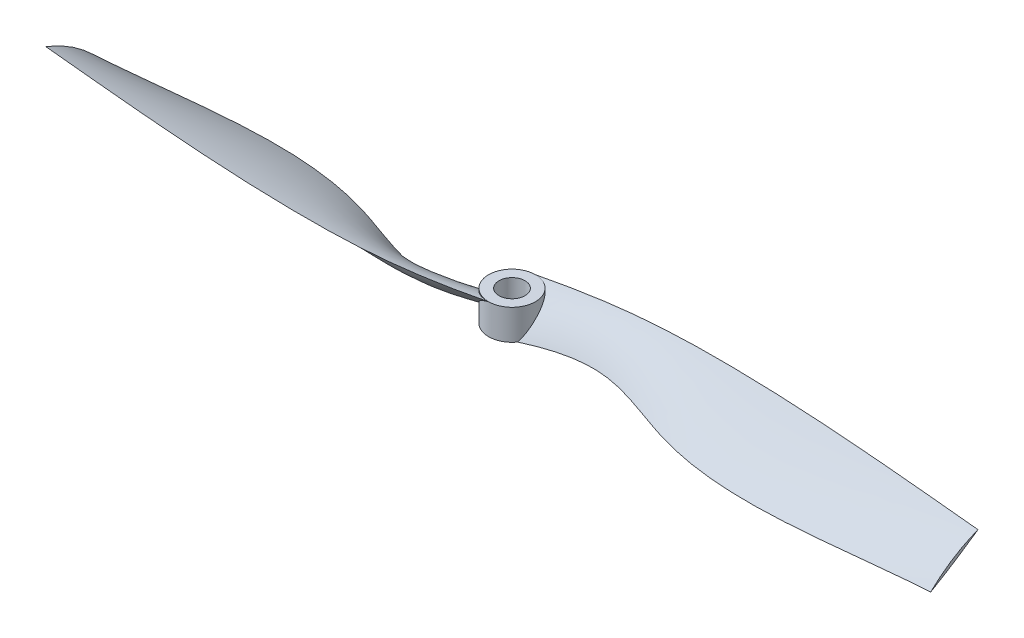
ISO-10303-21;
HEADER;
FILE_DESCRIPTION(('STEP AP214'),'2;1');
FILE_NAME('part.step','',(''),(''),'','','');
FILE_SCHEMA(('AUTOMOTIVE_DESIGN { 1 0 10303 214 1 1 1 1 }'));
ENDSEC;
DATA;
#1=APPLICATION_CONTEXT('core data for automotive mechanical design processes');
#2=APPLICATION_PROTOCOL_DEFINITION('international standard','automotive_design',2000,#1);
#3=PRODUCT_CONTEXT('',#1,'mechanical');
#4=PRODUCT('Part','Part','',(#3));
#5=PRODUCT_RELATED_PRODUCT_CATEGORY('part','',(#4));
#6=PRODUCT_DEFINITION_FORMATION('','',#4);
#7=PRODUCT_DEFINITION_CONTEXT('part definition',#1,'design');
#8=PRODUCT_DEFINITION('design','',#6,#7);
#9=PRODUCT_DEFINITION_SHAPE('','',#8);
#10=(LENGTH_UNIT() NAMED_UNIT(*) SI_UNIT(.MILLI.,.METRE.));
#11=(NAMED_UNIT(*) PLANE_ANGLE_UNIT() SI_UNIT($,.RADIAN.));
#12=(NAMED_UNIT(*) SI_UNIT($,.STERADIAN.) SOLID_ANGLE_UNIT());
#13=UNCERTAINTY_MEASURE_WITH_UNIT(LENGTH_MEASURE(1.E-05),#10,'distance_accuracy_value','');
#14=(GEOMETRIC_REPRESENTATION_CONTEXT(3) GLOBAL_UNCERTAINTY_ASSIGNED_CONTEXT((#13)) GLOBAL_UNIT_ASSIGNED_CONTEXT((#10,
#11,#12)) REPRESENTATION_CONTEXT('',''));
#15=CARTESIAN_POINT('',(0.,0.,0.));
#16=DIRECTION('',(0.,0.,1.));
#17=DIRECTION('',(1.,0.,0.));
#18=AXIS2_PLACEMENT_3D('',#15,#16,#17);
#19=CARTESIAN_POINT('',(0.,3.5,0.));
#20=DIRECTION('',(0.,-1.,0.));
#21=DIRECTION('',(0.,0.,-1.));
#22=AXIS2_PLACEMENT_3D('',#19,#20,#21);
#23=CYLINDRICAL_SURFACE('',#22,5.4);
#24=CARTESIAN_POINT('',(0.,-3.5,0.));
#25=DIRECTION('',(0.,1.,0.));
#26=DIRECTION('',(0.,0.,1.));
#27=AXIS2_PLACEMENT_3D('',#24,#25,#26);
#28=CIRCLE('',#27,5.4);
#29=CARTESIAN_POINT('',(-4.42153871093102,-3.5,-3.09999926253837));
#30=VERTEX_POINT('',#29);
#31=CARTESIAN_POINT('',(4.42153871093102,-3.5,3.09999926253837));
#32=VERTEX_POINT('',#31);
#33=EDGE_CURVE('E43',#30,#32,#28,.T.);
#34=ORIENTED_EDGE('',*,*,#33,.T.);
#35=CARTESIAN_POINT('',(4.42153871093102,-3.5,3.09999926253837));
#36=CARTESIAN_POINT('',(4.46274032845653,-3.4332596109734,3.04121880173989));
#37=CARTESIAN_POINT('',(4.50226301038118,-3.36556674417809,2.98236842523043));
#38=CARTESIAN_POINT('',(4.57818270502359,-3.2286509153384,2.86446880598099));
#39=CARTESIAN_POINT('',(4.61458049463764,-3.15942833901599,2.80541961648499));
#40=CARTESIAN_POINT('',(4.68446691957244,-3.01986618856876,2.68709503586211));
#41=CARTESIAN_POINT('',(4.71795851126925,-2.94952783775064,2.62781994019167));
#42=CARTESIAN_POINT('',(4.78225579516463,-2.80793451781135,2.50890354205042));
#43=CARTESIAN_POINT('',(4.81306129280275,-2.73667948272071,2.4492622133868));
#44=CARTESIAN_POINT('',(4.90167408364064,-2.52190506903903,2.26967785354244));
#45=CARTESIAN_POINT('',(4.95568311027789,-2.37736534987981,2.14906518548834));
#46=CARTESIAN_POINT('',(5.05495760627506,-2.08526469556819,1.90396761382263));
#47=CARTESIAN_POINT('',(5.10010434742793,-1.93768863929287,1.77945306975395));
#48=CARTESIAN_POINT('',(5.18115773456361,-1.64247993916782,1.52745636368072));
#49=CARTESIAN_POINT('',(5.2170626403101,-1.49484728989536,1.39997364769069));
#50=CARTESIAN_POINT('',(5.27962041636862,-1.20059788286626,1.14160948253018));
#51=CARTESIAN_POINT('',(5.30627372250697,-1.05398107757398,1.01072819377266));
#52=CARTESIAN_POINT('',(5.3457723297265,-0.791029028872365,0.771013145435731));
#53=CARTESIAN_POINT('',(5.3602942955066,-0.674345211913465,0.66283662869607));
#54=CARTESIAN_POINT('',(5.38284503794041,-0.442782060976604,0.443941245223382));
#55=CARTESIAN_POINT('',(5.39087517713352,-0.327902353308487,0.333222916998899));
#56=CARTESIAN_POINT('',(5.40006105914017,-0.100422661009188,0.109151522360341));
#57=CARTESIAN_POINT('',(5.4012159984033,0.0121770556115914,-0.00420185047472414));
#58=CARTESIAN_POINT('',(5.39617794077688,0.234100094520888,-0.233041361763288));
#59=CARTESIAN_POINT('',(5.39001456279705,0.343434800182564,-0.3485170536302));
#60=CARTESIAN_POINT('',(5.36983294678711,0.558735946117716,-0.581903050771586));
#61=CARTESIAN_POINT('',(5.3558151291518,0.664702566341191,-0.699813225419439));
#62=CARTESIAN_POINT('',(5.31931194890085,0.872649432949757,-0.937764824548423));
#63=CARTESIAN_POINT('',(5.2968293905647,0.974630987208451,-1.05780553067107));
#64=CARTESIAN_POINT('',(5.2408584967523,1.18096490191177,-1.30803634619239));
#65=CARTESIAN_POINT('',(5.20671402140603,1.28498968447556,-1.43835214950685));
#66=CARTESIAN_POINT('',(5.12718842819552,1.48704312036879,-1.70019212563268));
#67=CARTESIAN_POINT('',(5.08180907997348,1.58507271499064,-1.83171610500162));
#68=CARTESIAN_POINT('',(4.97908281037961,1.77438798226409,-2.09491787014866));
#69=CARTESIAN_POINT('',(4.92173911024035,1.86567546119602,-2.2265956050605));
#70=CARTESIAN_POINT('',(4.79447833265996,2.04086504826742,-2.48881727210416));
#71=CARTESIAN_POINT('',(4.72456107226371,2.12476704891596,-2.61936118770905));
#72=CARTESIAN_POINT('',(4.57110945600634,2.28534628464075,-2.87886680521823));
#73=CARTESIAN_POINT('',(4.48746077844135,2.36195351067683,-3.00780450386313));
#74=CARTESIAN_POINT('',(4.30691542930918,2.50673955005529,-3.2610827272484));
#75=CARTESIAN_POINT('',(4.21001857436033,2.57491824670483,-3.3854231883234));
#76=CARTESIAN_POINT('',(4.00329875584586,2.7027078550697,-3.62752329923112));
#77=CARTESIAN_POINT('',(3.89348011757408,2.76232161895906,-3.74528513176542));
#78=CARTESIAN_POINT('',(3.6615421806222,2.87315041501566,-3.9723335473523));
#79=CARTESIAN_POINT('',(3.53942443775241,2.92436650732167,-4.08162119928272));
#80=CARTESIAN_POINT('',(3.30045739417401,3.01267056545271,-4.27639711165135));
#81=CARTESIAN_POINT('',(3.18497932999765,3.05072939642684,-4.3631336585759));
#82=CARTESIAN_POINT('',(2.94625022630216,3.12117882259513,-4.52776191658591));
#83=CARTESIAN_POINT('',(2.82299944988176,3.15356960950711,-4.60565392680064));
#84=CARTESIAN_POINT('',(2.56959215698793,3.21315832591706,-4.75169376191945));
#85=CARTESIAN_POINT('',(2.43943277295592,3.24035407722736,-4.819837496548));
#86=CARTESIAN_POINT('',(2.17325504261599,3.29004621296248,-4.94556629009211));
#87=CARTESIAN_POINT('',(2.03723687184039,3.31254273806061,-5.00315166507026));
#88=CARTESIAN_POINT('',(1.76449131669241,3.35275230624365,-5.1056010643945));
#89=CARTESIAN_POINT('',(1.62790418335913,3.37058726317697,-5.15079127665522));
#90=CARTESIAN_POINT('',(1.35118082433203,3.40278024641318,-5.23020349827175));
#91=CARTESIAN_POINT('',(1.21104469725939,3.41713836921519,-5.26442581204885));
#92=CARTESIAN_POINT('',(0.9284924127026,3.44277351236691,-5.32152624765928));
#93=CARTESIAN_POINT('',(0.786081101218947,3.454056343641,-5.34442583201194));
#94=CARTESIAN_POINT('',(0.499758174433112,3.473939574675,-5.3787554764918));
#95=CARTESIAN_POINT('',(0.355847508354317,3.48254157627511,-5.39019239484068));
#96=CARTESIAN_POINT('',(0.176425143269606,3.49176997264785,-5.39723286523522));
#97=CARTESIAN_POINT('',(0.141135652113325,3.49351317887583,-5.39827087312406));
#98=CARTESIAN_POINT('',(0.0705660864384261,3.49685986879952,-5.39965403755672));
#99=CARTESIAN_POINT('',(0.0352860287658672,3.49846346823568,-5.39999977336036));
#100=CARTESIAN_POINT('',(0.,3.5,-5.4));
#101=B_SPLINE_CURVE_WITH_KNOTS('',3,(#35,#36,#37,#38,#39,#40,#41,#42,#43,#44,#45,#46,#47,#48,
#49,#50,#51,#52,#53,#54,#55,#56,#57,#58,#59,#60,#61,#62,#63,#64,#65,#66,#67,#68,#69,#70,#71,#72,
#73,#74,#75,#76,#77,#78,#79,#80,#81,#82,#83,#84,#85,#86,#87,#88,#89,#90,#91,#92,#93,#94,#95,#96,
#97,#98,#99,#100),.UNSPECIFIED.,.F.,.F.,(4,2,2,2,2,2,2,2,2,2,2,2,2,2,2,2,2,2,2,2,2,2,2,2,2,2,2,
2,2,2,2,2,4),(0.,0.294004526473737,0.587935745946308,0.881564365442731,1.17521423555069,
1.76246785042509,2.35711998397875,2.95188400866676,3.54662001128096,4.02579915507174,
4.50487770004362,4.98401223701774,5.4612141979532,5.93839061994788,6.41540909731794,
6.92557035605195,7.43565130865661,7.94559510598498,8.45554632399419,8.96998122878728,
9.48442325512461,9.99869357012648,10.5128989125512,10.9604064129298,11.4078987737376,
11.8555783504193,12.3032445237044,12.7376554544466,13.172054326781,13.6056265979084,
14.0389393035011,14.1449786125251,14.2509291558402),.UNSPECIFIED.);
#102=CARTESIAN_POINT('',(0.,3.5,-5.4));
#103=VERTEX_POINT('',#102);
#104=EDGE_CURVE('E55',#32,#103,#101,.T.);
#105=ORIENTED_EDGE('',*,*,#104,.T.);
#106=CARTESIAN_POINT('',(0.,3.5,0.));
#107=DIRECTION('',(0.,1.,0.));
#108=DIRECTION('',(0.,0.,1.));
#109=AXIS2_PLACEMENT_3D('',#106,#107,#108);
#110=CIRCLE('',#109,5.4);
#111=CARTESIAN_POINT('',(0.,3.5,5.4));
#112=VERTEX_POINT('',#111);
#113=EDGE_CURVE('E11',#112,#103,#110,.T.);
#114=ORIENTED_EDGE('',*,*,#113,.F.);
#115=CARTESIAN_POINT('',(0.,3.5,5.4));
#116=CARTESIAN_POINT('',(-0.0707858134417736,3.48091821182338,5.4000010979483));
#117=CARTESIAN_POINT('',(-0.141159099592832,3.46038164612316,5.39860796107764));
#118=CARTESIAN_POINT('',(-0.280915799746423,3.41655853242023,5.39314133091157));
#119=CARTESIAN_POINT('',(-0.350299516953975,3.393272847961,5.38906867746802));
#120=CARTESIAN_POINT('',(-0.556404298251706,3.3196481069175,5.37302182551285));
#121=CARTESIAN_POINT('',(-0.691472402381236,3.26543399747185,5.35721751044642));
#122=CARTESIAN_POINT('',(-0.954298276029214,3.14895734832722,5.31664973141016));
#123=CARTESIAN_POINT('',(-1.08213231677436,3.08681920226518,5.29201586356687));
#124=CARTESIAN_POINT('',(-1.33218977701914,2.95523352538069,5.23466684469635));
#125=CARTESIAN_POINT('',(-1.4544087949733,2.88578039624981,5.20194547796627));
#126=CARTESIAN_POINT('',(-1.73017569946259,2.71828401982639,5.11793526015965));
#127=CARTESIAN_POINT('',(-1.8816134216347,2.61807739516424,5.06403806934928));
#128=CARTESIAN_POINT('',(-2.17447972132289,2.4098771434268,4.94536293285828));
#129=CARTESIAN_POINT('',(-2.31590644941445,2.30188208492221,4.88058298412187));
#130=CARTESIAN_POINT('',(-2.59012308467206,2.07936648043181,4.74079298038951));
#131=CARTESIAN_POINT('',(-2.72284213016003,1.96480392581106,4.66571145819854));
#132=CARTESIAN_POINT('',(-2.97892274299725,1.73161750474006,4.5065225843431));
#133=CARTESIAN_POINT('',(-3.10228394552262,1.61299348021116,4.42241488109323));
#134=CARTESIAN_POINT('',(-3.38082776684156,1.33194354313384,4.21540069409932));
#135=CARTESIAN_POINT('',(-3.53241000490193,1.16845086485391,4.08908206168021));
#136=CARTESIAN_POINT('',(-3.81991412142354,0.839537102747605,3.82188058165099));
#137=CARTESIAN_POINT('',(-3.95583055577445,0.674115370404468,3.68099270307702));
#138=CARTESIAN_POINT('',(-4.2116462797738,0.344112868358875,3.38528795333648));
#139=CARTESIAN_POINT('',(-4.33157675814337,0.179531081978262,3.23049922104511));
#140=CARTESIAN_POINT('',(-4.55504212767296,-0.146918041780629,2.90692734007983));
#141=CARTESIAN_POINT('',(-4.65858243775036,-0.308786260427006,2.7381488449382));
#142=CARTESIAN_POINT('',(-4.82950236363335,-0.596617416835274,2.42109257624631));
#143=CARTESIAN_POINT('',(-4.89999493065186,-0.723418736828002,2.27524845488439));
#144=CARTESIAN_POINT('',(-5.02860042385979,-0.972908489861069,1.97480969611024));
#145=CARTESIAN_POINT('',(-5.08671381149742,-1.09559707606461,1.82021538514343));
#146=CARTESIAN_POINT('',(-5.18931556653845,-1.33563541201418,1.50291871991248));
#147=CARTESIAN_POINT('',(-5.23382258643629,-1.45299228108793,1.34022782420882));
#148=CARTESIAN_POINT('',(-5.3079653534059,-1.68149315086206,1.00726169445123));
#149=CARTESIAN_POINT('',(-5.33760403669836,-1.79263837439176,0.836987965103434));
#150=CARTESIAN_POINT('',(-5.37662708899515,-1.98797882020035,0.521790547502838));
#151=CARTESIAN_POINT('',(-5.38872953167201,-2.07337773090123,0.377946283234322));
#152=CARTESIAN_POINT('',(-5.40126909433515,-2.23885339927565,0.0867360324809098));
#153=CARTESIAN_POINT('',(-5.40170816558656,-2.31893104495305,-0.0606293607951717));
#154=CARTESIAN_POINT('',(-5.39017625361745,-2.47335342608326,-0.357976285231312));
#155=CARTESIAN_POINT('',(-5.37819849507458,-2.54769500782216,-0.507959200732527));
#156=CARTESIAN_POINT('',(-5.3411741064474,-2.69019954159914,-0.809254157260895));
#157=CARTESIAN_POINT('',(-5.31612785835943,-2.75836267416702,-0.960566159311304));
#158=CARTESIAN_POINT('',(-5.25223299343627,-2.88867006739196,-1.26423723381654));
#159=CARTESIAN_POINT('',(-5.21328532848512,-2.95076695327924,-1.41659591873518));
#160=CARTESIAN_POINT('',(-5.1213072084853,-3.06813900776087,-1.71967529044172));
#161=CARTESIAN_POINT('',(-5.06827855965255,-3.12341504995708,-1.87039618473532));
#162=CARTESIAN_POINT('',(-4.94820493098927,-3.2268896395644,-2.16817517229426));
#163=CARTESIAN_POINT('',(-4.88119463727255,-3.27510520829679,-2.31524134041343));
#164=CARTESIAN_POINT('',(-4.73327108557409,-3.36454441783017,-2.60431645651322));
#165=CARTESIAN_POINT('',(-4.65236985325138,-3.40577404566364,-2.74632965163241));
#166=CARTESIAN_POINT('',(-4.54179636272231,-3.45341319573212,-2.92129060894348));
#167=CARTESIAN_POINT('',(-4.51837109333311,-3.46306769347944,-2.95739441164213));
#168=CARTESIAN_POINT('',(-4.47062758582126,-3.48189281332493,-3.02908224436315));
#169=CARTESIAN_POINT('',(-4.44631022737404,-3.49106389146124,-3.06466674049583));
#170=CARTESIAN_POINT('',(-4.42153871093103,-3.5,-3.09999926253837));
#171=B_SPLINE_CURVE_WITH_KNOTS('',3,(#115,#116,#117,#118,#119,#120,#121,#122,#123,#124,#125,
#126,#127,#128,#129,#130,#131,#132,#133,#134,#135,#136,#137,#138,#139,#140,#141,#142,#143,#144,
#145,#146,#147,#148,#149,#150,#151,#152,#153,#154,#155,#156,#157,#158,#159,#160,#161,#162,#163,
#164,#165,#166,#167,#168,#169,#170),.UNSPECIFIED.,.F.,.F.,(4,2,2,2,2,2,2,2,2,2,2,2,2,2,2,2,2,2,
2,2,2,2,2,2,2,2,2,4),(0.,0.219874510686586,0.439680138013953,0.878074238199103,1.31028091861436,
1.74282081301863,2.31019258045134,2.87766889169029,3.44930242397569,4.02095823046469,
4.78871151127846,5.5567307989496,6.32322903027714,7.08947331027037,7.70607213087307,
8.32264796301809,8.93837472298337,9.55397984041984,10.0566602663991,10.5592565941417,
11.0621273111998,11.5649833300003,12.0714961845916,12.5779440984087,13.0831502286949,
13.5879211771847,13.7202333561413,13.8524183973755),.UNSPECIFIED.);
#172=EDGE_CURVE('E168',#112,#30,#171,.T.);
#173=ORIENTED_EDGE('',*,*,#172,.T.);
#174=EDGE_LOOP('',(#34,#105,#114,#173));
#175=FACE_BOUND('',#174,.T.);
#176=ADVANCED_FACE('F38',(#175),#23,.T.);
#177=CARTESIAN_POINT('',(0.,3.5,0.));
#178=DIRECTION('',(0.,1.,0.));
#179=DIRECTION('',(0.,0.,1.));
#180=AXIS2_PLACEMENT_3D('',#177,#178,#179);
#181=PLANE('',#180);
#182=ORIENTED_EDGE('',*,*,#113,.T.);
#183=EDGE_CURVE('E48',#103,#112,#110,.T.);
#184=ORIENTED_EDGE('',*,*,#183,.T.);
#185=EDGE_LOOP('',(#182,#184));
#186=FACE_BOUND('',#185,.T.);
#187=CARTESIAN_POINT('',(0.,3.5,0.));
#188=DIRECTION('',(0.,1.,0.));
#189=DIRECTION('',(0.,0.,1.));
#190=AXIS2_PLACEMENT_3D('',#187,#188,#189);
#191=CIRCLE('',#190,3.);
#192=CARTESIAN_POINT('',(0.,3.5,3.));
#193=VERTEX_POINT('',#192);
#194=EDGE_CURVE('E163',#193,#193,#191,.T.);
#195=ORIENTED_EDGE('',*,*,#194,.F.);
#196=EDGE_LOOP('',(#195));
#197=FACE_BOUND('',#196,.T.);
#198=ADVANCED_FACE('F218',(#186,#197),#181,.T.);
#199=CARTESIAN_POINT('',(0.,-3.5,0.));
#200=DIRECTION('',(0.,1.,0.));
#201=DIRECTION('',(0.,0.,1.));
#202=AXIS2_PLACEMENT_3D('',#199,#200,#201);
#203=PLANE('',#202);
#204=ORIENTED_EDGE('',*,*,#33,.F.);
#205=EDGE_CURVE('E63',#32,#30,#28,.T.);
#206=ORIENTED_EDGE('',*,*,#205,.F.);
#207=EDGE_LOOP('',(#204,#206));
#208=FACE_BOUND('',#207,.T.);
#209=CARTESIAN_POINT('',(0.,-3.5,0.));
#210=DIRECTION('',(0.,1.,0.));
#211=DIRECTION('',(0.,0.,1.));
#212=AXIS2_PLACEMENT_3D('',#209,#210,#211);
#213=CIRCLE('',#212,3.);
#214=CARTESIAN_POINT('',(0.,-3.5,3.));
#215=VERTEX_POINT('',#214);
#216=EDGE_CURVE('E171',#215,#215,#213,.T.);
#217=ORIENTED_EDGE('',*,*,#216,.T.);
#218=EDGE_LOOP('',(#217));
#219=FACE_BOUND('',#218,.T.);
#220=ADVANCED_FACE('F160',(#208,#219),#203,.F.);
#221=ORIENTED_EDGE('',*,*,#183,.F.);
#222=CARTESIAN_POINT('',(0.,3.5,-5.4));
#223=CARTESIAN_POINT('',(0.0707858134417736,3.48091821182338,-5.4000010979483));
#224=CARTESIAN_POINT('',(0.141159099592832,3.46038164612316,-5.39860796107764));
#225=CARTESIAN_POINT('',(0.280915799746423,3.41655853242023,-5.39314133091157));
#226=CARTESIAN_POINT('',(0.350299516953975,3.393272847961,-5.38906867746802));
#227=CARTESIAN_POINT('',(0.556404298251706,3.3196481069175,-5.37302182551285));
#228=CARTESIAN_POINT('',(0.691472402381236,3.26543399747185,-5.35721751044642));
#229=CARTESIAN_POINT('',(0.954298276029214,3.14895734832722,-5.31664973141016));
#230=CARTESIAN_POINT('',(1.08213231677436,3.08681920226518,-5.29201586356687));
#231=CARTESIAN_POINT('',(1.33218977701914,2.95523352538069,-5.23466684469635));
#232=CARTESIAN_POINT('',(1.4544087949733,2.88578039624981,-5.20194547796627));
#233=CARTESIAN_POINT('',(1.73017569946259,2.71828401982639,-5.11793526015965));
#234=CARTESIAN_POINT('',(1.8816134216347,2.61807739516424,-5.06403806934928));
#235=CARTESIAN_POINT('',(2.17447972132289,2.4098771434268,-4.94536293285828));
#236=CARTESIAN_POINT('',(2.31590644941445,2.30188208492221,-4.88058298412187));
#237=CARTESIAN_POINT('',(2.59012308467206,2.07936648043181,-4.74079298038951));
#238=CARTESIAN_POINT('',(2.72284213016003,1.96480392581106,-4.66571145819854));
#239=CARTESIAN_POINT('',(2.97892274299725,1.73161750474006,-4.5065225843431));
#240=CARTESIAN_POINT('',(3.10228394552262,1.61299348021116,-4.42241488109323));
#241=CARTESIAN_POINT('',(3.38082776684156,1.33194354313384,-4.21540069409932));
#242=CARTESIAN_POINT('',(3.53241000490193,1.16845086485391,-4.08908206168021));
#243=CARTESIAN_POINT('',(3.81991412142354,0.839537102747605,-3.82188058165099));
#244=CARTESIAN_POINT('',(3.95583055577445,0.674115370404468,-3.68099270307702));
#245=CARTESIAN_POINT('',(4.2116462797738,0.344112868358875,-3.38528795333648));
#246=CARTESIAN_POINT('',(4.33157675814337,0.179531081978262,-3.23049922104511));
#247=CARTESIAN_POINT('',(4.55504212767296,-0.146918041780629,-2.90692734007983));
#248=CARTESIAN_POINT('',(4.65858243775036,-0.308786260427006,-2.7381488449382));
#249=CARTESIAN_POINT('',(4.82950236363335,-0.596617416835274,-2.42109257624631));
#250=CARTESIAN_POINT('',(4.89999493065186,-0.723418736828002,-2.27524845488439));
#251=CARTESIAN_POINT('',(5.02860042385979,-0.972908489861069,-1.97480969611024));
#252=CARTESIAN_POINT('',(5.08671381149742,-1.09559707606461,-1.82021538514343));
#253=CARTESIAN_POINT('',(5.18931556653845,-1.33563541201418,-1.50291871991248));
#254=CARTESIAN_POINT('',(5.23382258643629,-1.45299228108793,-1.34022782420882));
#255=CARTESIAN_POINT('',(5.3079653534059,-1.68149315086206,-1.00726169445123));
#256=CARTESIAN_POINT('',(5.33760403669836,-1.79263837439176,-0.836987965103434));
#257=CARTESIAN_POINT('',(5.37662708899515,-1.98797882020035,-0.521790547502838));
#258=CARTESIAN_POINT('',(5.38872953167201,-2.07337773090123,-0.377946283234322));
#259=CARTESIAN_POINT('',(5.40126909433515,-2.23885339927565,-0.0867360324809098));
#260=CARTESIAN_POINT('',(5.40170816558656,-2.31893104495305,0.0606293607951717));
#261=CARTESIAN_POINT('',(5.39017625361745,-2.47335342608326,0.357976285231312));
#262=CARTESIAN_POINT('',(5.37819849507458,-2.54769500782216,0.507959200732527));
#263=CARTESIAN_POINT('',(5.3411741064474,-2.69019954159914,0.809254157260895));
#264=CARTESIAN_POINT('',(5.31612785835943,-2.75836267416702,0.960566159311304));
#265=CARTESIAN_POINT('',(5.25223299343627,-2.88867006739196,1.26423723381654));
#266=CARTESIAN_POINT('',(5.21328532848512,-2.95076695327924,1.41659591873518));
#267=CARTESIAN_POINT('',(5.1213072084853,-3.06813900776087,1.71967529044172));
#268=CARTESIAN_POINT('',(5.06827855965255,-3.12341504995708,1.87039618473532));
#269=CARTESIAN_POINT('',(4.94820493098927,-3.2268896395644,2.16817517229426));
#270=CARTESIAN_POINT('',(4.88119463727255,-3.27510520829679,2.31524134041343));
#271=CARTESIAN_POINT('',(4.73327108557409,-3.36454441783017,2.60431645651322));
#272=CARTESIAN_POINT('',(4.65236985325138,-3.40577404566364,2.74632965163241));
#273=CARTESIAN_POINT('',(4.54179636272231,-3.45341319573212,2.92129060894348));
#274=CARTESIAN_POINT('',(4.51837109333311,-3.46306769347944,2.95739441164213));
#275=CARTESIAN_POINT('',(4.47062758582126,-3.48189281332493,3.02908224436315));
#276=CARTESIAN_POINT('',(4.44631022737404,-3.49106389146124,3.06466674049583));
#277=CARTESIAN_POINT('',(4.42153871093103,-3.5,3.09999926253837));
#278=B_SPLINE_CURVE_WITH_KNOTS('',3,(#222,#223,#224,#225,#226,#227,#228,#229,#230,#231,#232,
#233,#234,#235,#236,#237,#238,#239,#240,#241,#242,#243,#244,#245,#246,#247,#248,#249,#250,#251,
#252,#253,#254,#255,#256,#257,#258,#259,#260,#261,#262,#263,#264,#265,#266,#267,#268,#269,#270,
#271,#272,#273,#274,#275,#276,#277),.UNSPECIFIED.,.F.,.F.,(4,2,2,2,2,2,2,2,2,2,2,2,2,2,2,2,2,2,
2,2,2,2,2,2,2,2,2,4),(0.,0.219874510686586,0.439680138013953,0.878074238199103,1.31028091861436,
1.74282081301863,2.31019258045134,2.87766889169029,3.44930242397569,4.02095823046469,
4.78871151127846,5.5567307989496,6.32322903027714,7.08947331027037,7.70607213087307,
8.32264796301809,8.93837472298337,9.55397984041984,10.0566602663991,10.5592565941417,
11.0621273111998,11.5649833300003,12.0714961845916,12.5779440984087,13.0831502286949,
13.5879211771847,13.7202333561413,13.8524183973755),.UNSPECIFIED.);
#279=EDGE_CURVE('E90',#103,#32,#278,.T.);
#280=ORIENTED_EDGE('',*,*,#279,.T.);
#281=ORIENTED_EDGE('',*,*,#205,.T.);
#282=CARTESIAN_POINT('',(-4.42153871093102,-3.5,-3.09999926253837));
#283=CARTESIAN_POINT('',(-4.46274032845653,-3.4332596109734,-3.04121880173989));
#284=CARTESIAN_POINT('',(-4.50226301038118,-3.36556674417809,-2.98236842523043));
#285=CARTESIAN_POINT('',(-4.57818270502359,-3.2286509153384,-2.86446880598099));
#286=CARTESIAN_POINT('',(-4.61458049463764,-3.15942833901599,-2.80541961648499));
#287=CARTESIAN_POINT('',(-4.68446691957244,-3.01986618856876,-2.68709503586211));
#288=CARTESIAN_POINT('',(-4.71795851126925,-2.94952783775064,-2.62781994019167));
#289=CARTESIAN_POINT('',(-4.78225579516463,-2.80793451781135,-2.50890354205042));
#290=CARTESIAN_POINT('',(-4.81306129280275,-2.73667948272071,-2.4492622133868));
#291=CARTESIAN_POINT('',(-4.90167408364064,-2.52190506903903,-2.26967785354244));
#292=CARTESIAN_POINT('',(-4.95568311027789,-2.37736534987981,-2.14906518548834));
#293=CARTESIAN_POINT('',(-5.05495760627506,-2.08526469556819,-1.90396761382263));
#294=CARTESIAN_POINT('',(-5.10010434742793,-1.93768863929287,-1.77945306975395));
#295=CARTESIAN_POINT('',(-5.18115773456361,-1.64247993916782,-1.52745636368072));
#296=CARTESIAN_POINT('',(-5.2170626403101,-1.49484728989536,-1.39997364769069));
#297=CARTESIAN_POINT('',(-5.27962041636862,-1.20059788286626,-1.14160948253018));
#298=CARTESIAN_POINT('',(-5.30627372250697,-1.05398107757398,-1.01072819377266));
#299=CARTESIAN_POINT('',(-5.3457723297265,-0.791029028872365,-0.771013145435731));
#300=CARTESIAN_POINT('',(-5.3602942955066,-0.674345211913465,-0.66283662869607));
#301=CARTESIAN_POINT('',(-5.38284503794041,-0.442782060976604,-0.443941245223382));
#302=CARTESIAN_POINT('',(-5.39087517713352,-0.327902353308487,-0.333222916998899));
#303=CARTESIAN_POINT('',(-5.40006105914017,-0.100422661009188,-0.109151522360341));
#304=CARTESIAN_POINT('',(-5.4012159984033,0.0121770556115914,0.00420185047472414));
#305=CARTESIAN_POINT('',(-5.39617794077688,0.234100094520888,0.233041361763288));
#306=CARTESIAN_POINT('',(-5.39001456279705,0.343434800182564,0.3485170536302));
#307=CARTESIAN_POINT('',(-5.36983294678711,0.558735946117716,0.581903050771586));
#308=CARTESIAN_POINT('',(-5.3558151291518,0.664702566341191,0.699813225419439));
#309=CARTESIAN_POINT('',(-5.31931194890085,0.872649432949757,0.937764824548423));
#310=CARTESIAN_POINT('',(-5.2968293905647,0.974630987208451,1.05780553067107));
#311=CARTESIAN_POINT('',(-5.2408584967523,1.18096490191177,1.30803634619239));
#312=CARTESIAN_POINT('',(-5.20671402140603,1.28498968447556,1.43835214950685));
#313=CARTESIAN_POINT('',(-5.12718842819552,1.48704312036879,1.70019212563268));
#314=CARTESIAN_POINT('',(-5.08180907997348,1.58507271499064,1.83171610500162));
#315=CARTESIAN_POINT('',(-4.97908281037961,1.77438798226409,2.09491787014866));
#316=CARTESIAN_POINT('',(-4.92173911024035,1.86567546119602,2.2265956050605));
#317=CARTESIAN_POINT('',(-4.79447833265996,2.04086504826742,2.48881727210416));
#318=CARTESIAN_POINT('',(-4.72456107226371,2.12476704891596,2.61936118770905));
#319=CARTESIAN_POINT('',(-4.57110945600634,2.28534628464075,2.87886680521823));
#320=CARTESIAN_POINT('',(-4.48746077844135,2.36195351067683,3.00780450386313));
#321=CARTESIAN_POINT('',(-4.30691542930918,2.50673955005529,3.2610827272484));
#322=CARTESIAN_POINT('',(-4.21001857436033,2.57491824670483,3.3854231883234));
#323=CARTESIAN_POINT('',(-4.00329875584586,2.7027078550697,3.62752329923112));
#324=CARTESIAN_POINT('',(-3.89348011757408,2.76232161895906,3.74528513176542));
#325=CARTESIAN_POINT('',(-3.6615421806222,2.87315041501566,3.9723335473523));
#326=CARTESIAN_POINT('',(-3.53942443775241,2.92436650732167,4.08162119928272));
#327=CARTESIAN_POINT('',(-3.30045739417401,3.01267056545271,4.27639711165135));
#328=CARTESIAN_POINT('',(-3.18497932999765,3.05072939642684,4.3631336585759));
#329=CARTESIAN_POINT('',(-2.94625022630216,3.12117882259513,4.52776191658591));
#330=CARTESIAN_POINT('',(-2.82299944988176,3.15356960950711,4.60565392680064));
#331=CARTESIAN_POINT('',(-2.56959215698793,3.21315832591706,4.75169376191945));
#332=CARTESIAN_POINT('',(-2.43943277295592,3.24035407722736,4.819837496548));
#333=CARTESIAN_POINT('',(-2.17325504261599,3.29004621296248,4.94556629009211));
#334=CARTESIAN_POINT('',(-2.03723687184039,3.31254273806061,5.00315166507026));
#335=CARTESIAN_POINT('',(-1.76449131669241,3.35275230624365,5.1056010643945));
#336=CARTESIAN_POINT('',(-1.62790418335913,3.37058726317697,5.15079127665522));
#337=CARTESIAN_POINT('',(-1.35118082433203,3.40278024641318,5.23020349827175));
#338=CARTESIAN_POINT('',(-1.21104469725939,3.41713836921519,5.26442581204885));
#339=CARTESIAN_POINT('',(-0.9284924127026,3.44277351236691,5.32152624765928));
#340=CARTESIAN_POINT('',(-0.786081101218947,3.454056343641,5.34442583201194));
#341=CARTESIAN_POINT('',(-0.499758174433112,3.473939574675,5.3787554764918));
#342=CARTESIAN_POINT('',(-0.355847508354317,3.48254157627511,5.39019239484068));
#343=CARTESIAN_POINT('',(-0.176425143269606,3.49176997264785,5.39723286523522));
#344=CARTESIAN_POINT('',(-0.141135652113325,3.49351317887583,5.39827087312406));
#345=CARTESIAN_POINT('',(-0.0705660864384261,3.49685986879952,5.39965403755672));
#346=CARTESIAN_POINT('',(-0.0352860287658672,3.49846346823568,5.39999977336036));
#347=CARTESIAN_POINT('',(0.,3.5,5.4));
#348=B_SPLINE_CURVE_WITH_KNOTS('',3,(#282,#283,#284,#285,#286,#287,#288,#289,#290,#291,#292,
#293,#294,#295,#296,#297,#298,#299,#300,#301,#302,#303,#304,#305,#306,#307,#308,#309,#310,#311,
#312,#313,#314,#315,#316,#317,#318,#319,#320,#321,#322,#323,#324,#325,#326,#327,#328,#329,#330,
#331,#332,#333,#334,#335,#336,#337,#338,#339,#340,#341,#342,#343,#344,#345,#346,#347),
.UNSPECIFIED.,.F.,.F.,(4,2,2,2,2,2,2,2,2,2,2,2,2,2,2,2,2,2,2,2,2,2,2,2,2,2,2,2,2,2,2,2,4),(0.,
0.294004526473737,0.587935745946308,0.881564365442731,1.17521423555069,1.76246785042509,
2.35711998397875,2.95188400866676,3.54662001128096,4.02579915507174,4.50487770004362,
4.98401223701774,5.4612141979532,5.93839061994788,6.41540909731794,6.92557035605195,
7.43565130865661,7.94559510598498,8.45554632399419,8.96998122878728,9.48442325512461,
9.99869357012648,10.5128989125512,10.9604064129298,11.4078987737376,11.8555783504193,
12.3032445237044,12.7376554544466,13.172054326781,13.6056265979084,14.0389393035011,
14.1449786125251,14.2509291558402),.UNSPECIFIED.);
#349=EDGE_CURVE('E174',#30,#112,#348,.T.);
#350=ORIENTED_EDGE('',*,*,#349,.T.);
#351=EDGE_LOOP('',(#221,#280,#281,#350));
#352=FACE_BOUND('',#351,.T.);
#353=ADVANCED_FACE('F40',(#352),#23,.T.);
#354=CARTESIAN_POINT('',(0.,3.5,0.));
#355=DIRECTION('',(0.,-1.,0.));
#356=DIRECTION('',(0.,0.,-1.));
#357=AXIS2_PLACEMENT_3D('',#354,#355,#356);
#358=CYLINDRICAL_SURFACE('',#357,3.);
#359=ORIENTED_EDGE('',*,*,#194,.T.);
#360=EDGE_LOOP('',(#359));
#361=FACE_BOUND('',#360,.T.);
#362=ORIENTED_EDGE('',*,*,#216,.F.);
#363=EDGE_LOOP('',(#362));
#364=FACE_BOUND('',#363,.T.);
#365=ADVANCED_FACE('F194',(#361,#364),#358,.F.);
#366=CARTESIAN_POINT('',(0.,3.5,5.4));
#367=CARTESIAN_POINT('',(-6.61813777905888,3.49024504946924,7.02486724950979));
#368=CARTESIAN_POINT('',(-19.8766692108093,3.47636713842807,9.43501912154503));
#369=CARTESIAN_POINT('',(-53.687737847965,3.48282929163424,10.223904232374));
#370=CARTESIAN_POINT('',(-81.3555700301464,3.49189615598131,7.44199643569825));
#371=CARTESIAN_POINT('',(-102.,3.5,5.51203801882395));
#372=CARTESIAN_POINT('',(0.,2.73657788312784,0.944838094371212));
#373=CARTESIAN_POINT('',(-6.63431407492815,2.730074582774,3.2968593607339));
#374=CARTESIAN_POINT('',(-19.8686020191165,2.4939714082917,6.21527775065747));
#375=CARTESIAN_POINT('',(-53.7003923366585,1.84899618709107,2.66213471418029));
#376=CARTESIAN_POINT('',(-81.3149212190817,1.92039608077667,2.23963191506073));
#377=CARTESIAN_POINT('',(-102.,1.9257986434558,1.43033815814246));
#378=CARTESIAN_POINT('',(0.,0.403244549794503,-2.65516190562879));
#379=CARTESIAN_POINT('',(-6.65049037079741,0.399992899617584,0.424013377586791));
#380=CARTESIAN_POINT('',(-19.8605348274237,0.16851569548234,4.10649165110693));
#381=CARTESIAN_POINT('',(-53.7130468253521,-0.478613576787007,-5.14522076711705));
#382=CARTESIAN_POINT('',(-81.274272408017,-0.410235971217101,-2.51837875116994));
#383=CARTESIAN_POINT('',(-102.,-0.407534689877537,-2.20700784813219));
#384=CARTESIAN_POINT('',(0.,-3.5,-5.4));
#385=CARTESIAN_POINT('',(-6.66666666666667,-3.5,-1.59367069993153));
#386=CARTESIAN_POINT('',(-19.8524676357309,-3.5,3.1086608228934));
#387=CARTESIAN_POINT('',(-53.7257013140456,-3.5,-13.198162211518));
#388=CARTESIAN_POINT('',(-81.2336235969523,-3.5,-6.83203556299376));
#389=CARTESIAN_POINT('',(-102.,-3.5,-5.4));
#390=B_SPLINE_SURFACE_WITH_KNOTS('',3,3,((#366,#367,#368,#369,#370,#371),(#372,#373,#374,#375,
#376,#377),(#378,#379,#380,#381,#382,#383),(#384,#385,#386,#387,#388,#389)),.UNSPECIFIED.,.F.,
.F.,.F.,(4,4),(4,1,1,4),(0.,1.),(0.,0.199677300777836,0.396877664023051,1.),.UNSPECIFIED.);
#391=CARTESIAN_POINT('',(0.,-3.5,-5.4));
#392=CARTESIAN_POINT('',(-6.66666666666667,-3.5,-1.59367069993153));
#393=CARTESIAN_POINT('',(-19.8524676357309,-3.5,3.1086608228934));
#394=CARTESIAN_POINT('',(-53.7257013140456,-3.5,-13.198162211518));
#395=CARTESIAN_POINT('',(-81.2336235969523,-3.5,-6.83203556299376));
#396=CARTESIAN_POINT('',(-102.,-3.5,-5.4));
#397=B_SPLINE_CURVE_WITH_KNOTS('',3,(#391,#392,#393,#394,#395,#396),.UNSPECIFIED.,.F.,.F.,(4,1,
1,4),(0.,0.199677300777836,0.396877664023051,1.),.UNSPECIFIED.);
#398=CARTESIAN_POINT('',(-102.,-3.5,-5.4));
#399=VERTEX_POINT('',#398);
#400=EDGE_CURVE('E120',#30,#399,#397,.T.);
#401=CARTESIAN_POINT('',(-102.,-3.5,-5.4));
#402=CARTESIAN_POINT('',(-102.,1.13869796518369,-0.610511772198288));
#403=CARTESIAN_POINT('',(-102.,3.5,5.51203801882395));
#404=B_SPLINE_CURVE_WITH_KNOTS('',2,(#401,#402,#403),.UNSPECIFIED.,.F.,.F.,(3,3),(0.,1.),.UNSPECIFIED.);
#405=CARTESIAN_POINT('',(-102.,3.5,5.51203801882395));
#406=VERTEX_POINT('',#405);
#407=EDGE_CURVE('E302',#399,#406,#404,.T.);
#408=CARTESIAN_POINT('',(0.,3.5,5.4));
#409=CARTESIAN_POINT('',(-6.61813777905888,3.49024504946924,7.02486724950979));
#410=CARTESIAN_POINT('',(-19.8766692108093,3.47636713842807,9.43501912154503));
#411=CARTESIAN_POINT('',(-53.687737847965,3.48282929163424,10.223904232374));
#412=CARTESIAN_POINT('',(-81.3555700301464,3.49189615598131,7.44199643569825));
#413=CARTESIAN_POINT('',(-102.,3.5,5.51203801882395));
#414=B_SPLINE_CURVE_WITH_KNOTS('',3,(#408,#409,#410,#411,#412,#413),.UNSPECIFIED.,.F.,.F.,(4,1,
1,4),(0.,0.199677300777836,0.396877664023051,1.),.UNSPECIFIED.);
#415=EDGE_CURVE('E119',#406,#112,#414,.F.);
#416=ORIENTED_EDGE('',*,*,#349,.F.);
#417=ORIENTED_EDGE('',*,*,#400,.T.);
#418=ORIENTED_EDGE('',*,*,#407,.T.);
#419=ORIENTED_EDGE('',*,*,#415,.T.);
#420=EDGE_LOOP('',(#416,#417,#418,#419));
#421=FACE_BOUND('',#420,.T.);
#422=ADVANCED_FACE('F188',(#421),#390,.T.);
#423=CARTESIAN_POINT('',(0.,-3.5,-5.4));
#424=CARTESIAN_POINT('',(-6.66666666666667,-3.5,-1.59367069993153));
#425=CARTESIAN_POINT('',(-19.8524676357309,-3.5,3.1086608228934));
#426=CARTESIAN_POINT('',(-53.7257013140456,-3.5,-13.198162211518));
#427=CARTESIAN_POINT('',(-81.2336235969523,-3.5,-6.83203556299376));
#428=CARTESIAN_POINT('',(-102.,-3.5,-5.4));
#429=CARTESIAN_POINT('',(0.,-2.02393758993659,-1.12146957636275));
#430=CARTESIAN_POINT('',(-6.65049037079741,-2.02718924011351,1.95770570685283));
#431=CARTESIAN_POINT('',(-19.8605348274237,-2.29332740718873,6.38780961313163));
#432=CARTESIAN_POINT('',(-53.7130468253521,-0.578511802967531,-6.28018515622391));
#433=CARTESIAN_POINT('',(-81.274272408017,-1.33873520931559,-1.964459630447));
#434=CARTESIAN_POINT('',(-102.,-1.33603392797603,-1.65308872740926));
#435=CARTESIAN_POINT('',(0.,0.309395743396745,2.47853042363725));
#436=CARTESIAN_POINT('',(-6.63431407492815,0.302892443042906,4.83055168999994));
#437=CARTESIAN_POINT('',(-19.8686020191165,0.0321283056206238,8.49659571268217));
#438=CARTESIAN_POINT('',(-53.7003923366585,1.74909796091055,1.52717032507343));
#439=CARTESIAN_POINT('',(-81.3149212190817,0.991896842678181,2.79355103578367));
#440=CARTESIAN_POINT('',(-102.,0.997299405357308,1.98425727886539));
#441=CARTESIAN_POINT('',(0.,3.5,5.4));
#442=CARTESIAN_POINT('',(-6.61813777905888,3.49024504946924,7.02486724950979));
#443=CARTESIAN_POINT('',(-19.8766692108093,3.47636713842807,9.43501912154503));
#444=CARTESIAN_POINT('',(-53.687737847965,3.48282929163424,10.223904232374));
#445=CARTESIAN_POINT('',(-81.3555700301464,3.49189615598131,7.44199643569825));
#446=CARTESIAN_POINT('',(-102.,3.5,5.51203801882395));
#447=B_SPLINE_SURFACE_WITH_KNOTS('',3,3,((#423,#424,#425,#426,#427,#428),(#429,#430,#431,#432,
#433,#434),(#435,#436,#437,#438,#439,#440),(#441,#442,#443,#444,#445,#446)),.UNSPECIFIED.,.F.,
.F.,.F.,(4,4),(4,1,1,4),(0.,1.),(0.,0.199677300777836,0.396877664023051,1.),.UNSPECIFIED.);
#448=CARTESIAN_POINT('',(-102.,3.5,5.51203801882395));
#449=CARTESIAN_POINT('',(-102.,-0.254050891964038,0.220366908886114));
#450=CARTESIAN_POINT('',(-102.,-3.5,-5.4));
#451=B_SPLINE_CURVE_WITH_KNOTS('',2,(#448,#449,#450),.UNSPECIFIED.,.F.,.F.,(3,3),(0.,1.),.UNSPECIFIED.);
#452=EDGE_CURVE('E300',#406,#399,#451,.T.);
#453=ORIENTED_EDGE('',*,*,#172,.F.);
#454=ORIENTED_EDGE('',*,*,#415,.F.);
#455=ORIENTED_EDGE('',*,*,#452,.T.);
#456=ORIENTED_EDGE('',*,*,#400,.F.);
#457=EDGE_LOOP('',(#453,#454,#455,#456));
#458=FACE_BOUND('',#457,.T.);
#459=ADVANCED_FACE('F193',(#458),#447,.T.);
#460=CARTESIAN_POINT('',(-102.,-0.127025445982019,0.138192959149045));
#461=DIRECTION('',(1.,0.,0.));
#462=DIRECTION('',(0.,0.,-1.));
#463=AXIS2_PLACEMENT_3D('',#460,#461,#462);
#464=PLANE('',#463);
#465=ORIENTED_EDGE('',*,*,#452,.F.);
#466=ORIENTED_EDGE('',*,*,#407,.F.);
#467=EDGE_LOOP('',(#465,#466));
#468=FACE_BOUND('',#467,.T.);
#469=ADVANCED_FACE('F131',(#468),#464,.F.);
#470=CARTESIAN_POINT('',(0.,3.5,-5.4));
#471=CARTESIAN_POINT('',(6.61813777905888,3.49024504946924,-7.02486724950979));
#472=CARTESIAN_POINT('',(19.8766692108093,3.47636713842807,-9.43501912154503));
#473=CARTESIAN_POINT('',(53.687737847965,3.48282929163424,-10.223904232374));
#474=CARTESIAN_POINT('',(81.3555700301464,3.49189615598131,-7.44199643569825));
#475=CARTESIAN_POINT('',(102.,3.5,-5.51203801882395));
#476=CARTESIAN_POINT('',(0.,2.73657788312784,-0.944838094371212));
#477=CARTESIAN_POINT('',(6.63431407492815,2.730074582774,-3.2968593607339));
#478=CARTESIAN_POINT('',(19.8686020191165,2.4939714082917,-6.21527775065747));
#479=CARTESIAN_POINT('',(53.7003923366585,1.84899618709107,-2.66213471418029));
#480=CARTESIAN_POINT('',(81.3149212190817,1.92039608077667,-2.23963191506073));
#481=CARTESIAN_POINT('',(102.,1.9257986434558,-1.43033815814246));
#482=CARTESIAN_POINT('',(0.,0.403244549794503,2.65516190562879));
#483=CARTESIAN_POINT('',(6.65049037079741,0.399992899617584,-0.424013377586791));
#484=CARTESIAN_POINT('',(19.8605348274237,0.16851569548234,-4.10649165110693));
#485=CARTESIAN_POINT('',(53.7130468253521,-0.478613576787007,5.14522076711705));
#486=CARTESIAN_POINT('',(81.274272408017,-0.410235971217101,2.51837875116994));
#487=CARTESIAN_POINT('',(102.,-0.407534689877537,2.20700784813219));
#488=CARTESIAN_POINT('',(0.,-3.5,5.4));
#489=CARTESIAN_POINT('',(6.66666666666667,-3.5,1.59367069993153));
#490=CARTESIAN_POINT('',(19.8524676357309,-3.5,-3.1086608228934));
#491=CARTESIAN_POINT('',(53.7257013140456,-3.5,13.198162211518));
#492=CARTESIAN_POINT('',(81.2336235969523,-3.5,6.83203556299376));
#493=CARTESIAN_POINT('',(102.,-3.5,5.4));
#494=B_SPLINE_SURFACE_WITH_KNOTS('',3,3,((#470,#471,#472,#473,#474,#475),(#476,#477,#478,#479,
#480,#481),(#482,#483,#484,#485,#486,#487),(#488,#489,#490,#491,#492,#493)),.UNSPECIFIED.,.F.,
.F.,.F.,(4,4),(4,1,1,4),(0.,1.),(0.,0.199677300777836,0.396877664023051,1.),.UNSPECIFIED.);
#495=CARTESIAN_POINT('',(0.,-3.5,5.4));
#496=CARTESIAN_POINT('',(6.66666666666667,-3.5,1.59367069993153));
#497=CARTESIAN_POINT('',(19.8524676357309,-3.5,-3.1086608228934));
#498=CARTESIAN_POINT('',(53.7257013140456,-3.5,13.198162211518));
#499=CARTESIAN_POINT('',(81.2336235969523,-3.5,6.83203556299376));
#500=CARTESIAN_POINT('',(102.,-3.5,5.4));
#501=B_SPLINE_CURVE_WITH_KNOTS('',3,(#495,#496,#497,#498,#499,#500),.UNSPECIFIED.,.F.,.F.,(4,1,
1,4),(0.,0.199677300777836,0.396877664023051,1.),.UNSPECIFIED.);
#502=CARTESIAN_POINT('',(102.,-3.5,5.4));
#503=VERTEX_POINT('',#502);
#504=EDGE_CURVE('E94',#32,#503,#501,.T.);
#505=CARTESIAN_POINT('',(102.,-3.5,5.4));
#506=CARTESIAN_POINT('',(102.,1.13869796518369,0.610511772198288));
#507=CARTESIAN_POINT('',(102.,3.5,-5.51203801882395));
#508=B_SPLINE_CURVE_WITH_KNOTS('',2,(#505,#506,#507),.UNSPECIFIED.,.F.,.F.,(3,3),(0.,1.),.UNSPECIFIED.);
#509=CARTESIAN_POINT('',(102.,3.5,-5.51203801882395));
#510=VERTEX_POINT('',#509);
#511=EDGE_CURVE('E87',#503,#510,#508,.T.);
#512=CARTESIAN_POINT('',(0.,3.5,-5.4));
#513=CARTESIAN_POINT('',(6.61813777905888,3.49024504946924,-7.02486724950979));
#514=CARTESIAN_POINT('',(19.8766692108093,3.47636713842807,-9.43501912154503));
#515=CARTESIAN_POINT('',(53.687737847965,3.48282929163424,-10.223904232374));
#516=CARTESIAN_POINT('',(81.3555700301464,3.49189615598131,-7.44199643569825));
#517=CARTESIAN_POINT('',(102.,3.5,-5.51203801882395));
#518=B_SPLINE_CURVE_WITH_KNOTS('',3,(#512,#513,#514,#515,#516,#517),.UNSPECIFIED.,.F.,.F.,(4,1,
1,4),(0.,0.199677300777836,0.396877664023051,1.),.UNSPECIFIED.);
#519=EDGE_CURVE('E93',#510,#103,#518,.F.);
#520=ORIENTED_EDGE('',*,*,#104,.F.);
#521=ORIENTED_EDGE('',*,*,#504,.T.);
#522=ORIENTED_EDGE('',*,*,#511,.T.);
#523=ORIENTED_EDGE('',*,*,#519,.T.);
#524=EDGE_LOOP('',(#520,#521,#522,#523));
#525=FACE_BOUND('',#524,.T.);
#526=ADVANCED_FACE('F92',(#525),#494,.T.);
#527=CARTESIAN_POINT('',(0.,-3.5,5.4));
#528=CARTESIAN_POINT('',(6.66666666666667,-3.5,1.59367069993153));
#529=CARTESIAN_POINT('',(19.8524676357309,-3.5,-3.1086608228934));
#530=CARTESIAN_POINT('',(53.7257013140456,-3.5,13.198162211518));
#531=CARTESIAN_POINT('',(81.2336235969523,-3.5,6.83203556299376));
#532=CARTESIAN_POINT('',(102.,-3.5,5.4));
#533=CARTESIAN_POINT('',(0.,-2.02393758993659,1.12146957636275));
#534=CARTESIAN_POINT('',(6.65049037079741,-2.02718924011351,-1.95770570685283));
#535=CARTESIAN_POINT('',(19.8605348274237,-2.29332740718873,-6.38780961313163));
#536=CARTESIAN_POINT('',(53.7130468253521,-0.578511802967531,6.28018515622391));
#537=CARTESIAN_POINT('',(81.274272408017,-1.33873520931559,1.964459630447));
#538=CARTESIAN_POINT('',(102.,-1.33603392797603,1.65308872740926));
#539=CARTESIAN_POINT('',(0.,0.309395743396745,-2.47853042363725));
#540=CARTESIAN_POINT('',(6.63431407492815,0.302892443042906,-4.83055168999994));
#541=CARTESIAN_POINT('',(19.8686020191165,0.0321283056206238,-8.49659571268217));
#542=CARTESIAN_POINT('',(53.7003923366585,1.74909796091055,-1.52717032507343));
#543=CARTESIAN_POINT('',(81.3149212190817,0.991896842678181,-2.79355103578367));
#544=CARTESIAN_POINT('',(102.,0.997299405357308,-1.98425727886539));
#545=CARTESIAN_POINT('',(0.,3.5,-5.4));
#546=CARTESIAN_POINT('',(6.61813777905888,3.49024504946924,-7.02486724950979));
#547=CARTESIAN_POINT('',(19.8766692108093,3.47636713842807,-9.43501912154503));
#548=CARTESIAN_POINT('',(53.687737847965,3.48282929163424,-10.223904232374));
#549=CARTESIAN_POINT('',(81.3555700301464,3.49189615598131,-7.44199643569825));
#550=CARTESIAN_POINT('',(102.,3.5,-5.51203801882395));
#551=B_SPLINE_SURFACE_WITH_KNOTS('',3,3,((#527,#528,#529,#530,#531,#532),(#533,#534,#535,#536,
#537,#538),(#539,#540,#541,#542,#543,#544),(#545,#546,#547,#548,#549,#550)),.UNSPECIFIED.,.F.,
.F.,.F.,(4,4),(4,1,1,4),(0.,1.),(0.,0.199677300777836,0.396877664023051,1.),.UNSPECIFIED.);
#552=CARTESIAN_POINT('',(102.,3.5,-5.51203801882395));
#553=CARTESIAN_POINT('',(102.,-0.254050891964038,-0.220366908886114));
#554=CARTESIAN_POINT('',(102.,-3.5,5.4));
#555=B_SPLINE_CURVE_WITH_KNOTS('',2,(#552,#553,#554),.UNSPECIFIED.,.F.,.F.,(3,3),(0.,1.),.UNSPECIFIED.);
#556=EDGE_CURVE('E84',#510,#503,#555,.T.);
#557=ORIENTED_EDGE('',*,*,#279,.F.);
#558=ORIENTED_EDGE('',*,*,#519,.F.);
#559=ORIENTED_EDGE('',*,*,#556,.T.);
#560=ORIENTED_EDGE('',*,*,#504,.F.);
#561=EDGE_LOOP('',(#557,#558,#559,#560));
#562=FACE_BOUND('',#561,.T.);
#563=ADVANCED_FACE('F96',(#562),#551,.T.);
#564=CARTESIAN_POINT('',(102.,-0.127025445982019,-0.138192959149045));
#565=DIRECTION('',(-1.,0.,0.));
#566=DIRECTION('',(0.,0.,1.));
#567=AXIS2_PLACEMENT_3D('',#564,#565,#566);
#568=PLANE('',#567);
#569=ORIENTED_EDGE('',*,*,#556,.F.);
#570=ORIENTED_EDGE('',*,*,#511,.F.);
#571=EDGE_LOOP('',(#569,#570));
#572=FACE_BOUND('',#571,.T.);
#573=ADVANCED_FACE('F86',(#572),#568,.F.);
#574=CLOSED_SHELL('',(#176,#198,#220,#353,#365,#422,#459,#469,#526,#563,#573));
#575=MANIFOLD_SOLID_BREP('B2',#574);
#576=ADVANCED_BREP_SHAPE_REPRESENTATION('',(#18,#575),#14);
#577=SHAPE_DEFINITION_REPRESENTATION(#9,#576);
ENDSEC;
END-ISO-10303-21;
